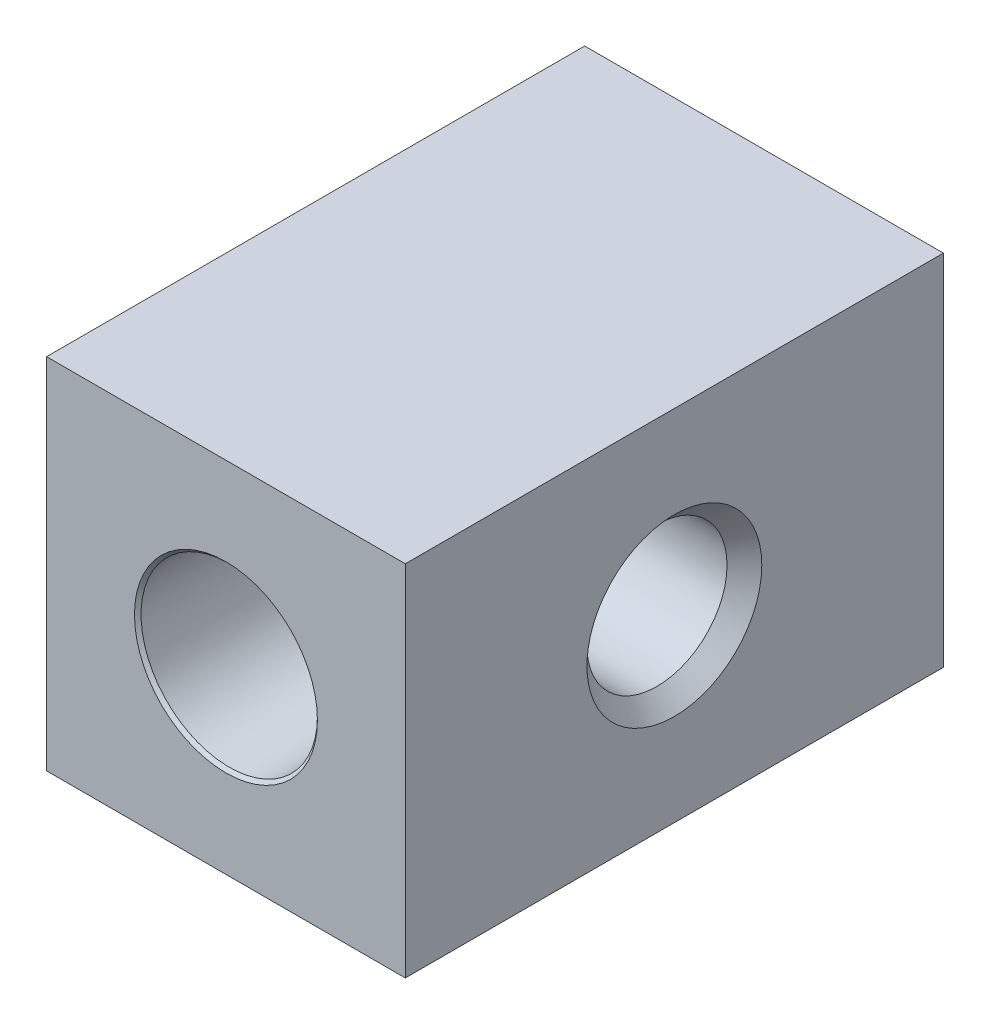
ISO-10303-21;
HEADER;
FILE_DESCRIPTION(('STEP AP214'),'2;1');
FILE_NAME('part.step','',(''),(''),'','','');
FILE_SCHEMA(('AUTOMOTIVE_DESIGN { 1 0 10303 214 1 1 1 1 }'));
ENDSEC;
DATA;
#1=APPLICATION_CONTEXT('core data for automotive mechanical design processes');
#2=APPLICATION_PROTOCOL_DEFINITION('international standard','automotive_design',2000,#1);
#3=PRODUCT_CONTEXT('',#1,'mechanical');
#4=PRODUCT('Part','Part','',(#3));
#5=PRODUCT_RELATED_PRODUCT_CATEGORY('part','',(#4));
#6=PRODUCT_DEFINITION_FORMATION('','',#4);
#7=PRODUCT_DEFINITION_CONTEXT('part definition',#1,'design');
#8=PRODUCT_DEFINITION('design','',#6,#7);
#9=PRODUCT_DEFINITION_SHAPE('','',#8);
#10=(LENGTH_UNIT() NAMED_UNIT(*) SI_UNIT(.MILLI.,.METRE.));
#11=(NAMED_UNIT(*) PLANE_ANGLE_UNIT() SI_UNIT($,.RADIAN.));
#12=(NAMED_UNIT(*) SI_UNIT($,.STERADIAN.) SOLID_ANGLE_UNIT());
#13=UNCERTAINTY_MEASURE_WITH_UNIT(LENGTH_MEASURE(1.E-05),#10,'distance_accuracy_value','');
#14=(GEOMETRIC_REPRESENTATION_CONTEXT(3) GLOBAL_UNCERTAINTY_ASSIGNED_CONTEXT((#13)) GLOBAL_UNIT_ASSIGNED_CONTEXT((#10,
#11,#12)) REPRESENTATION_CONTEXT('',''));
#15=CARTESIAN_POINT('',(0.,0.,0.));
#16=DIRECTION('',(0.,0.,1.));
#17=DIRECTION('',(1.,0.,0.));
#18=AXIS2_PLACEMENT_3D('',#15,#16,#17);
#19=CARTESIAN_POINT('',(12.7,12.7,38.1));
#20=DIRECTION('',(-1.,0.,0.));
#21=DIRECTION('',(0.,-1.,0.));
#22=AXIS2_PLACEMENT_3D('',#19,#20,#21);
#23=PLANE('',#22);
#24=CARTESIAN_POINT('',(12.7,0.,19.05));
#25=DIRECTION('',(1.,0.,0.));
#26=DIRECTION('',(0.,0.,-1.));
#27=AXIS2_PLACEMENT_3D('',#24,#25,#26);
#28=CIRCLE('',#27,6.19125);
#29=CARTESIAN_POINT('',(12.7,0.,12.85875));
#30=VERTEX_POINT('',#29);
#31=EDGE_CURVE('E182',#30,#30,#28,.T.);
#32=ORIENTED_EDGE('',*,*,#31,.F.);
#33=EDGE_LOOP('',(#32));
#34=FACE_BOUND('',#33,.T.);
#35=DIRECTION('',(0.,1.,0.));
#36=VECTOR('',#35,1.);
#37=CARTESIAN_POINT('',(12.7,12.7,0.));
#38=LINE('',#37,#36);
#39=CARTESIAN_POINT('',(12.7,-12.7,0.));
#40=VERTEX_POINT('',#39);
#41=CARTESIAN_POINT('',(12.7,12.7,0.));
#42=VERTEX_POINT('',#41);
#43=EDGE_CURVE('E126',#40,#42,#38,.T.);
#44=ORIENTED_EDGE('',*,*,#43,.T.);
#45=DIRECTION('',(0.,0.,-1.));
#46=VECTOR('',#45,1.);
#47=CARTESIAN_POINT('',(12.7,12.7,38.1));
#48=LINE('',#47,#46);
#49=CARTESIAN_POINT('',(12.7,12.7,38.1));
#50=VERTEX_POINT('',#49);
#51=EDGE_CURVE('E11',#50,#42,#48,.T.);
#52=ORIENTED_EDGE('',*,*,#51,.F.);
#53=DIRECTION('',(0.,1.,0.));
#54=VECTOR('',#53,1.);
#55=CARTESIAN_POINT('',(12.7,12.7,38.1));
#56=LINE('',#55,#54);
#57=CARTESIAN_POINT('',(12.7,-12.7,38.1));
#58=VERTEX_POINT('',#57);
#59=EDGE_CURVE('E109',#58,#50,#56,.T.);
#60=ORIENTED_EDGE('',*,*,#59,.F.);
#61=DIRECTION('',(0.,0.,-1.));
#62=VECTOR('',#61,1.);
#63=CARTESIAN_POINT('',(12.7,-12.7,38.1));
#64=LINE('',#63,#62);
#65=EDGE_CURVE('E122',#58,#40,#64,.T.);
#66=ORIENTED_EDGE('',*,*,#65,.T.);
#67=EDGE_LOOP('',(#44,#52,#60,#66));
#68=FACE_BOUND('',#67,.T.);
#69=ADVANCED_FACE('F51',(#34,#68),#23,.F.);
#70=CARTESIAN_POINT('',(-12.7,12.7,38.1));
#71=DIRECTION('',(0.,-1.,0.));
#72=DIRECTION('',(0.,0.,-1.));
#73=AXIS2_PLACEMENT_3D('',#70,#71,#72);
#74=PLANE('',#73);
#75=DIRECTION('',(-1.,0.,0.));
#76=VECTOR('',#75,1.);
#77=CARTESIAN_POINT('',(-12.7,12.7,0.));
#78=LINE('',#77,#76);
#79=CARTESIAN_POINT('',(-12.7,12.7,0.));
#80=VERTEX_POINT('',#79);
#81=EDGE_CURVE('E114',#42,#80,#78,.T.);
#82=ORIENTED_EDGE('',*,*,#81,.T.);
#83=DIRECTION('',(0.,0.,-1.));
#84=VECTOR('',#83,1.);
#85=CARTESIAN_POINT('',(-12.7,12.7,38.1));
#86=LINE('',#85,#84);
#87=CARTESIAN_POINT('',(-12.7,12.7,38.1));
#88=VERTEX_POINT('',#87);
#89=EDGE_CURVE('E66',#88,#80,#86,.T.);
#90=ORIENTED_EDGE('',*,*,#89,.F.);
#91=DIRECTION('',(-1.,0.,0.));
#92=VECTOR('',#91,1.);
#93=CARTESIAN_POINT('',(-12.7,12.7,38.1));
#94=LINE('',#93,#92);
#95=EDGE_CURVE('E104',#50,#88,#94,.T.);
#96=ORIENTED_EDGE('',*,*,#95,.F.);
#97=ORIENTED_EDGE('',*,*,#51,.T.);
#98=EDGE_LOOP('',(#82,#90,#96,#97));
#99=FACE_BOUND('',#98,.T.);
#100=ADVANCED_FACE('F113',(#99),#74,.F.);
#101=CARTESIAN_POINT('',(-12.7,12.7,38.1));
#102=DIRECTION('',(1.,0.,0.));
#103=DIRECTION('',(0.,1.,0.));
#104=AXIS2_PLACEMENT_3D('',#101,#102,#103);
#105=PLANE('',#104);
#106=DIRECTION('',(0.,-1.,0.));
#107=VECTOR('',#106,1.);
#108=CARTESIAN_POINT('',(-12.7,12.7,0.));
#109=LINE('',#108,#107);
#110=CARTESIAN_POINT('',(-12.7,-12.7,0.));
#111=VERTEX_POINT('',#110);
#112=EDGE_CURVE('E91',#80,#111,#109,.T.);
#113=ORIENTED_EDGE('',*,*,#112,.T.);
#114=DIRECTION('',(0.,0.,-1.));
#115=VECTOR('',#114,1.);
#116=CARTESIAN_POINT('',(-12.7,-12.7,38.1));
#117=LINE('',#116,#115);
#118=CARTESIAN_POINT('',(-12.7,-12.7,38.1));
#119=VERTEX_POINT('',#118);
#120=EDGE_CURVE('E116',#119,#111,#117,.T.);
#121=ORIENTED_EDGE('',*,*,#120,.F.);
#122=DIRECTION('',(0.,-1.,0.));
#123=VECTOR('',#122,1.);
#124=CARTESIAN_POINT('',(-12.7,12.7,38.1));
#125=LINE('',#124,#123);
#126=EDGE_CURVE('E107',#88,#119,#125,.T.);
#127=ORIENTED_EDGE('',*,*,#126,.F.);
#128=ORIENTED_EDGE('',*,*,#89,.T.);
#129=EDGE_LOOP('',(#113,#121,#127,#128));
#130=FACE_BOUND('',#129,.T.);
#131=ADVANCED_FACE('F118',(#130),#105,.F.);
#132=CARTESIAN_POINT('',(-12.7,-12.7,38.1));
#133=DIRECTION('',(0.,1.,0.));
#134=DIRECTION('',(0.,0.,1.));
#135=AXIS2_PLACEMENT_3D('',#132,#133,#134);
#136=PLANE('',#135);
#137=DIRECTION('',(1.,0.,0.));
#138=VECTOR('',#137,1.);
#139=CARTESIAN_POINT('',(-12.7,-12.7,0.));
#140=LINE('',#139,#138);
#141=EDGE_CURVE('E97',#111,#40,#140,.T.);
#142=ORIENTED_EDGE('',*,*,#141,.T.);
#143=ORIENTED_EDGE('',*,*,#65,.F.);
#144=DIRECTION('',(1.,0.,0.));
#145=VECTOR('',#144,1.);
#146=CARTESIAN_POINT('',(-12.7,-12.7,38.1));
#147=LINE('',#146,#145);
#148=EDGE_CURVE('E74',#119,#58,#147,.T.);
#149=ORIENTED_EDGE('',*,*,#148,.F.);
#150=ORIENTED_EDGE('',*,*,#120,.T.);
#151=EDGE_LOOP('',(#142,#143,#149,#150));
#152=FACE_BOUND('',#151,.T.);
#153=ADVANCED_FACE('F140',(#152),#136,.F.);
#154=CARTESIAN_POINT('',(0.,0.,38.1));
#155=DIRECTION('',(0.,0.,1.));
#156=DIRECTION('',(1.,0.,0.));
#157=AXIS2_PLACEMENT_3D('',#154,#155,#156);
#158=PLANE('',#157);
#159=CARTESIAN_POINT('',(0.,0.,38.1));
#160=DIRECTION('',(0.,0.,1.));
#161=DIRECTION('',(1.,0.,0.));
#162=AXIS2_PLACEMENT_3D('',#159,#160,#161);
#163=CIRCLE('',#162,6.477);
#164=CARTESIAN_POINT('',(6.477,0.,38.1));
#165=VERTEX_POINT('',#164);
#166=EDGE_CURVE('E158',#165,#165,#163,.T.);
#167=ORIENTED_EDGE('',*,*,#166,.F.);
#168=EDGE_LOOP('',(#167));
#169=FACE_BOUND('',#168,.T.);
#170=ORIENTED_EDGE('',*,*,#59,.T.);
#171=ORIENTED_EDGE('',*,*,#95,.T.);
#172=ORIENTED_EDGE('',*,*,#126,.T.);
#173=ORIENTED_EDGE('',*,*,#148,.T.);
#174=EDGE_LOOP('',(#170,#171,#172,#173));
#175=FACE_BOUND('',#174,.T.);
#176=ADVANCED_FACE('F105',(#169,#175),#158,.T.);
#177=CARTESIAN_POINT('',(0.,0.,0.));
#178=DIRECTION('',(0.,0.,1.));
#179=DIRECTION('',(1.,0.,0.));
#180=AXIS2_PLACEMENT_3D('',#177,#178,#179);
#181=PLANE('',#180);
#182=CARTESIAN_POINT('',(0.,0.,0.));
#183=DIRECTION('',(0.,0.,-1.));
#184=DIRECTION('',(-1.,0.,0.));
#185=AXIS2_PLACEMENT_3D('',#182,#183,#184);
#186=CIRCLE('',#185,6.477);
#187=CARTESIAN_POINT('',(-6.477,0.,0.));
#188=VERTEX_POINT('',#187);
#189=EDGE_CURVE('E174',#188,#188,#186,.T.);
#190=ORIENTED_EDGE('',*,*,#189,.F.);
#191=EDGE_LOOP('',(#190));
#192=FACE_BOUND('',#191,.T.);
#193=ORIENTED_EDGE('',*,*,#43,.F.);
#194=ORIENTED_EDGE('',*,*,#141,.F.);
#195=ORIENTED_EDGE('',*,*,#112,.F.);
#196=ORIENTED_EDGE('',*,*,#81,.F.);
#197=EDGE_LOOP('',(#193,#194,#195,#196));
#198=FACE_BOUND('',#197,.T.);
#199=ADVANCED_FACE('F143',(#192,#198),#181,.F.);
#200=CARTESIAN_POINT('',(0.,0.,38.1));
#201=DIRECTION('',(0.,0.,1.));
#202=DIRECTION('',(1.,0.,0.));
#203=AXIS2_PLACEMENT_3D('',#200,#201,#202);
#204=CYLINDRICAL_SURFACE('',#203,5.5626);
#205=CARTESIAN_POINT('',(5.5626,0.,14.08938));
#206=CARTESIAN_POINT('',(5.56259949190071,0.115252980041368,14.0893805122402));
#207=CARTESIAN_POINT('',(5.55901059956937,0.230514411394984,14.0934039638876));
#208=CARTESIAN_POINT('',(5.54473406575567,0.460086380413685,14.1094210002691));
#209=CARTESIAN_POINT('',(5.53404302223932,0.574396435772569,14.1214184046442));
#210=CARTESIAN_POINT('',(5.50578060750856,0.801237720933191,14.1531740281014));
#211=CARTESIAN_POINT('',(5.48819921358699,0.913766109919133,14.1729435526448));
#212=CARTESIAN_POINT('',(5.44652522096436,1.13608183250098,14.2198876244221));
#213=CARTESIAN_POINT('',(5.42242958119108,1.24586785965366,14.2470656302371));
#214=CARTESIAN_POINT('',(5.36840350945301,1.46115946784248,14.3081448544504));
#215=CARTESIAN_POINT('',(5.33851692791091,1.5666904336828,14.3419955768647));
#216=CARTESIAN_POINT('',(5.2733298261402,1.77378610759023,14.4160442633293));
#217=CARTESIAN_POINT('',(5.23802732161843,1.87534934477465,14.4562445539031));
#218=CARTESIAN_POINT('',(5.12484025955753,2.17338329338206,14.5855875874288));
#219=CARTESIAN_POINT('',(5.03962815680738,2.36338369792312,14.6835263708614));
#220=CARTESIAN_POINT('',(4.88241970055584,2.66918292387232,14.8661377715473));
#221=CARTESIAN_POINT('',(4.81422308516397,2.79004143346305,14.9458613185622));
#222=CARTESIAN_POINT('',(4.67199005212612,3.02217289074067,15.1136680618453));
#223=CARTESIAN_POINT('',(4.59795327871513,3.13344525360293,15.201751767456));
#224=CARTESIAN_POINT('',(4.4452405116387,3.34657953499793,15.385573472074));
#225=CARTESIAN_POINT('',(4.36655389471765,3.44841842340169,15.4813291915274));
#226=CARTESIAN_POINT('',(4.20603143395974,3.64248108408585,15.6796400899204));
#227=CARTESIAN_POINT('',(4.12419600849026,3.73470612771431,15.7821943668675));
#228=CARTESIAN_POINT('',(3.95682716682526,3.91167516338512,15.9961075789501));
#229=CARTESIAN_POINT('',(3.87125197613791,3.99620129934715,16.1076137169746));
#230=CARTESIAN_POINT('',(3.69975323604535,4.15548288960014,16.3372074153377));
#231=CARTESIAN_POINT('',(3.61382959347561,4.23023552505319,16.4552968604639));
#232=CARTESIAN_POINT('',(3.44371513254162,4.36983061166718,16.698000639979));
#233=CARTESIAN_POINT('',(3.35952142226834,4.43469100651044,16.8226025961943));
#234=CARTESIAN_POINT('',(3.19527803581857,4.55445128444737,17.0790258131456));
#235=CARTESIAN_POINT('',(3.11522554958533,4.60935798676526,17.2108420501966));
#236=CARTESIAN_POINT('',(2.96232201891316,4.70909095818097,17.4836457121999));
#237=CARTESIAN_POINT('',(2.88952360961916,4.75384618883875,17.6246893737475));
#238=CARTESIAN_POINT('',(2.75747220625048,4.83163832211537,17.9161134922143));
#239=CARTESIAN_POINT('',(2.69820103236246,4.86469098565409,18.0664810683501));
#240=CARTESIAN_POINT('',(2.60934071220724,4.91284158970409,18.3507950974902));
#241=CARTESIAN_POINT('',(2.57645600812314,4.93001034416246,18.4833185015918));
#242=CARTESIAN_POINT('',(2.53095522009755,4.95353281423675,18.7526339438798));
#243=CARTESIAN_POINT('',(2.51829233700312,4.95991150322591,18.8894153769621));
#244=CARTESIAN_POINT('',(2.51571876186817,4.96121783332367,19.16372345259));
#245=CARTESIAN_POINT('',(2.52588375931951,4.95610738028207,19.3012510614811));
#246=CARTESIAN_POINT('',(2.56700824513023,4.93492522078184,19.572362288627));
#247=CARTESIAN_POINT('',(2.59801268983963,4.91882981563888,19.7059367270363));
#248=CARTESIAN_POINT('',(2.69488946388761,4.8666516108559,20.031026485035));
#249=CARTESIAN_POINT('',(2.77041652956899,4.82462654883108,20.2186334759294));
#250=CARTESIAN_POINT('',(2.89819216338976,4.74821383178061,20.4891187362788));
#251=CARTESIAN_POINT('',(2.943324960665,4.7204302741996,20.5776602665114));
#252=CARTESIAN_POINT('',(3.03712769599841,4.66062835875333,20.7513863532979));
#253=CARTESIAN_POINT('',(3.08579678501031,4.62861101589539,20.8365717081277));
#254=CARTESIAN_POINT('',(3.22408596948067,4.53422729753461,21.0684651235543));
#255=CARTESIAN_POINT('',(3.31629596117094,4.46752349877629,21.2118621801457));
#256=CARTESIAN_POINT('',(3.50403472122369,4.32185443628983,21.4900763928202));
#257=CARTESIAN_POINT('',(3.59956575125456,4.24288068436623,21.6248875175483));
#258=CARTESIAN_POINT('',(3.7909535326138,4.07278523925148,21.8862771809006));
#259=CARTESIAN_POINT('',(3.88681015121405,3.98166802490132,22.0128587293298));
#260=CARTESIAN_POINT('',(4.07655252007048,3.78717551846553,22.2577225354059));
#261=CARTESIAN_POINT('',(4.17043911219892,3.68380559342417,22.3760083909333));
#262=CARTESIAN_POINT('',(4.3377421967348,3.48428961245477,22.5833085504458));
#263=CARTESIAN_POINT('',(4.41180488034349,3.39018456610727,22.6737627644791));
#264=CARTESIAN_POINT('',(4.55619529593195,3.19351104438786,22.8482285623899));
#265=CARTESIAN_POINT('',(4.62652209715971,3.0909404760322,22.9322385430544));
#266=CARTESIAN_POINT('',(4.82997448589683,2.77084238560862,23.17326883126));
#267=CARTESIAN_POINT('',(4.95600786814505,2.5404243202581,23.3198213800049));
#268=CARTESIAN_POINT('',(5.15517450988648,2.10042335116978,23.5492805426492));
#269=CARTESIAN_POINT('',(5.23385576398246,1.89698951008563,23.639096448429));
#270=CARTESIAN_POINT('',(5.33485575134705,1.57931146644192,23.7538540937933));
#271=CARTESIAN_POINT('',(5.36569180933124,1.47129824203251,23.7887860672551));
#272=CARTESIAN_POINT('',(5.42112951611027,1.25167086339119,23.8514677241027));
#273=CARTESIAN_POINT('',(5.44573388274316,1.14005830297009,23.8792205386603));
#274=CARTESIAN_POINT('',(5.48836172672968,0.913141377573817,23.9272399335587));
#275=CARTESIAN_POINT('',(5.5063374751949,0.797816498979234,23.9474522306649));
#276=CARTESIAN_POINT('',(5.53505933185562,0.565133092629889,23.9797229254185));
#277=CARTESIAN_POINT('',(5.54580542352336,0.447774560226609,23.9917813044252));
#278=CARTESIAN_POINT('',(5.55980804162621,0.212092557170456,24.0074903118468));
#279=CARTESIAN_POINT('',(5.5630673438686,0.0937694604742748,24.0111440563705));
#280=CARTESIAN_POINT('',(5.56202464017189,-0.142793809279318,24.009974819591));
#281=CARTESIAN_POINT('',(5.55772327035698,-0.26103398847574,24.0051525514249));
#282=CARTESIAN_POINT('',(5.5425329671392,-0.483646247271601,23.9881086328893));
#283=CARTESIAN_POINT('',(5.53240544858138,-0.588137259141981,23.9767421233162));
#284=CARTESIAN_POINT('',(5.50641781198981,-0.795501449203402,23.9475414167033));
#285=CARTESIAN_POINT('',(5.49055581559502,-0.898374085751421,23.9297051004349));
#286=CARTESIAN_POINT('',(5.43476975506949,-1.20350306506847,23.8668804752369));
#287=CARTESIAN_POINT('',(5.3866325848794,-1.40245176525898,23.8125619948953));
#288=CARTESIAN_POINT('',(5.2693098747484,-1.79458390934606,23.6794579671663));
#289=CARTESIAN_POINT('',(5.19937173360496,-1.98723381716843,23.5997950536119));
#290=CARTESIAN_POINT('',(5.04311010751813,-2.35576523625907,23.4203709973818));
#291=CARTESIAN_POINT('',(4.95678045039049,-2.53164039343825,23.320602283046));
#292=CARTESIAN_POINT('',(4.79441221635614,-2.82433675665093,23.1308574174977));
#293=CARTESIAN_POINT('',(4.72105309062738,-2.94505328445371,23.0444936981281));
#294=CARTESIAN_POINT('',(4.56875861100239,-3.17617809382747,22.8632927711931));
#295=CARTESIAN_POINT('',(4.48982273561578,-3.28658540912105,22.7684547709646));
#296=CARTESIAN_POINT('',(4.32760104663891,-3.49744828025104,22.570874639734));
#297=CARTESIAN_POINT('',(4.24430185432278,-3.59787011748778,22.4681076792028));
#298=CARTESIAN_POINT('',(4.0750740612814,-3.78847264593812,22.2555577500928));
#299=CARTESIAN_POINT('',(3.98914595510246,-3.87865524848147,22.1457760969263));
#300=CARTESIAN_POINT('',(3.8142071633545,-4.05089471641986,21.916878628063));
#301=CARTESIAN_POINT('',(3.72517099237549,-4.13271757911301,21.797606409433));
#302=CARTESIAN_POINT('',(3.54782489572548,-4.28592874023808,21.5519075964777));
#303=CARTESIAN_POINT('',(3.45951534251486,-4.3573119678742,21.425477566505));
#304=CARTESIAN_POINT('',(3.28640230542381,-4.48930717758529,21.1654391484579));
#305=CARTESIAN_POINT('',(3.20158918745861,-4.54995052069455,21.0318531954096));
#306=CARTESIAN_POINT('',(3.03876891213022,-4.66026152334538,20.7563709399695));
#307=CARTESIAN_POINT('',(2.96075395871779,-4.70994185809475,20.6144844772401));
#308=CARTESIAN_POINT('',(2.82366768728529,-4.7932474252926,20.3351837125752));
#309=CARTESIAN_POINT('',(2.76349733357817,-4.82795516245544,20.1986444616536));
#310=CARTESIAN_POINT('',(2.65897961294455,-4.88630336027154,19.9173379407858));
#311=CARTESIAN_POINT('',(2.61459801299699,-4.90996780008453,19.7725892709089));
#312=CARTESIAN_POINT('',(2.56488651240885,-4.93601377065626,19.5492835822142));
#313=CARTESIAN_POINT('',(2.55108278943874,-4.94313973046992,19.473139375887));
#314=CARTESIAN_POINT('',(2.53016839164672,-4.95387807813479,19.3197110028905));
#315=CARTESIAN_POINT('',(2.52305371091192,-4.95749256896692,19.2424275466969));
#316=CARTESIAN_POINT('',(2.51598738043387,-4.96108292942572,19.0874924940782));
#317=CARTESIAN_POINT('',(2.51603111041091,-4.96106114602624,19.009841167457));
#318=CARTESIAN_POINT('',(2.52325288200823,-4.9573909467926,18.8549754570299));
#319=CARTESIAN_POINT('',(2.53043091988356,-4.95374253286215,18.7777610729946));
#320=CARTESIAN_POINT('',(2.55866519167618,-4.93924785140876,18.5722729095104));
#321=CARTESIAN_POINT('',(2.58584391794516,-4.9251916557246,18.4450411202368));
#322=CARTESIAN_POINT('',(2.65509458676151,-4.88819912028295,18.1960672078814));
#323=CARTESIAN_POINT('',(2.69719100322434,-4.86524818200952,18.0743344787998));
#324=CARTESIAN_POINT('',(2.79074278898134,-4.81218222760155,17.8397213196375));
#325=CARTESIAN_POINT('',(2.84195518364768,-4.78224809035554,17.7267001450552));
#326=CARTESIAN_POINT('',(2.95118175095826,-4.71562743769569,17.5060078182964));
#327=CARTESIAN_POINT('',(3.0092019793767,-4.67893489369156,17.39834155254));
#328=CARTESIAN_POINT('',(3.12985616898902,-4.59910585799672,17.1875492991384));
#329=CARTESIAN_POINT('',(3.19250660724422,-4.55594573007932,17.0844418406807));
#330=CARTESIAN_POINT('',(3.32047732660933,-4.46353958322444,16.8827760668114));
#331=CARTESIAN_POINT('',(3.38579703432321,-4.41429486678915,16.7842167839742));
#332=CARTESIAN_POINT('',(3.54880030997988,-4.28530172751914,16.5460154658557));
#333=CARTESIAN_POINT('',(3.64729100477528,-4.20208101093785,16.4087914555243));
#334=CARTESIAN_POINT('',(3.84421216604824,-4.02272630337395,16.1429162133049));
#335=CARTESIAN_POINT('',(3.94264258312783,-3.92658631762985,16.0142690029091));
#336=CARTESIAN_POINT('',(4.13679595569573,-3.72146886393492,15.7660589115195));
#337=CARTESIAN_POINT('',(4.23252456804228,-3.61252113892556,15.6464760038442));
#338=CARTESIAN_POINT('',(4.41932938337021,-3.38144041711495,15.4167985579353));
#339=CARTESIAN_POINT('',(4.51040563074438,-3.25930754616078,15.3067039291579));
#340=CARTESIAN_POINT('',(4.72353697639025,-2.94624160638993,15.0520269711322));
#341=CARTESIAN_POINT('',(4.84208919237851,-2.74829442112411,14.9129508185251));
#342=CARTESIAN_POINT('',(5.05855379781159,-2.32588961162279,14.6615779446606));
#343=CARTESIAN_POINT('',(5.15648882755717,-2.10146149409114,14.5492518304644));
#344=CARTESIAN_POINT('',(5.31076090269409,-1.66795617276796,14.3733681138699));
#345=CARTESIAN_POINT('',(5.37129375533643,-1.46244615793199,14.3048237761806));
#346=CARTESIAN_POINT('',(5.44451672094022,-1.1452382147626,14.2221483887476));
#347=CARTESIAN_POINT('',(5.46598757932786,-1.03807686946506,14.197955032626));
#348=CARTESIAN_POINT('',(5.50271884820741,-0.821373148210311,14.156612766112));
#349=CARTESIAN_POINT('',(5.51798193260451,-0.711831818859315,14.1394608227071));
#350=CARTESIAN_POINT('',(5.54079260733708,-0.502129025497669,14.1138431353128));
#351=CARTESIAN_POINT('',(5.54895662489938,-0.402118337257024,14.1046830989358));
#352=CARTESIAN_POINT('',(5.55986112453924,-0.201407345689914,14.092450654981));
#353=CARTESIAN_POINT('',(5.56260044397206,-0.100706899171142,14.0893795524097));
#354=CARTESIAN_POINT('',(5.5626,0.,14.08938));
#355=B_SPLINE_CURVE_WITH_KNOTS('',3,(#205,#206,#207,#208,#209,#210,#211,#212,#213,#214,#215,
#216,#217,#218,#219,#220,#221,#222,#223,#224,#225,#226,#227,#228,#229,#230,#231,#232,#233,#234,
#235,#236,#237,#238,#239,#240,#241,#242,#243,#244,#245,#246,#247,#248,#249,#250,#251,#252,#253,
#254,#255,#256,#257,#258,#259,#260,#261,#262,#263,#264,#265,#266,#267,#268,#269,#270,#271,#272,
#273,#274,#275,#276,#277,#278,#279,#280,#281,#282,#283,#284,#285,#286,#287,#288,#289,#290,#291,
#292,#293,#294,#295,#296,#297,#298,#299,#300,#301,#302,#303,#304,#305,#306,#307,#308,#309,#310,
#311,#312,#313,#314,#315,#316,#317,#318,#319,#320,#321,#322,#323,#324,#325,#326,#327,#328,#329,
#330,#331,#332,#333,#334,#335,#336,#337,#338,#339,#340,#341,#342,#343,#344,#345,#346,#347,#348,
#349,#350,#351,#352,#353,#354),.UNSPECIFIED.,.T.,.F.,(4,2,2,2,2,2,2,2,2,2,2,2,2,2,2,2,2,2,2,2,2,
2,2,2,2,2,2,2,2,2,2,2,2,2,2,2,2,2,2,2,2,2,2,2,2,2,2,2,2,2,2,2,2,2,2,2,2,2,2,2,2,2,2,2,2,2,2,2,2,
2,2,2,2,2,4),(0.,0.345648881905928,0.691463454170411,1.03778292670527,1.38426435299766,
1.7282180115991,2.07229799069411,2.75986734391476,3.23944585082315,3.71905359481797,
4.19980294904244,4.68048864744546,5.17210706108524,5.66386695421921,6.15472394723617,
6.64524337517448,7.13909618811423,7.63228133127152,8.04351791345939,8.45380138856857,
8.86544723194859,9.27798396964242,9.89394632815633,10.2034270117262,10.5128336344848,
11.0612674734618,11.6100824152269,12.1586954963424,12.7070691508671,13.1568797609359,
13.6068019155487,14.504114819901,15.208763156076,15.5612888885135,15.913660607529,
16.2685221784585,16.6233845606364,16.9781153525383,17.332816300263,17.6492196064137,
17.9657266463205,18.5982003640966,19.2555210548088,19.9130897506092,20.4091679535346,
20.9052926070486,21.4030393916533,21.9006931099464,22.4097686964854,22.9190907385161,
23.4269000891952,23.9341192085485,24.3927176903526,24.8503156946934,25.0831321500982,
25.3158090881248,25.5483358492007,25.7808624882179,26.171758754975,26.5632993167397,
26.9456458766865,27.3283351613349,27.7124587498774,28.0965002527027,28.6607068334354,
29.2251761255337,29.7883595455586,30.3515375906922,31.1566892543265,31.9609520927299,
32.6326481709019,32.9681050142051,33.3034172111056,33.6053770305186,33.9074015602637),.UNSPECIFIED.);
#356=CARTESIAN_POINT('',(5.5626,0.,14.08938));
#357=VERTEX_POINT('',#356);
#358=EDGE_CURVE('E54',#357,#357,#355,.T.);
#359=ORIENTED_EDGE('',*,*,#358,.T.);
#360=EDGE_LOOP('',(#359));
#361=FACE_BOUND('',#360,.T.);
#362=CARTESIAN_POINT('',(0.,0.,10.02));
#363=DIRECTION('',(0.,0.,-1.));
#364=DIRECTION('',(-1.,0.,0.));
#365=AXIS2_PLACEMENT_3D('',#362,#363,#364);
#366=CIRCLE('',#365,5.56260000000001);
#367=CARTESIAN_POINT('',(-5.56260000000001,0.,10.02));
#368=VERTEX_POINT('',#367);
#369=EDGE_CURVE('E162',#368,#368,#366,.T.);
#370=ORIENTED_EDGE('',*,*,#369,.T.);
#371=EDGE_LOOP('',(#370));
#372=FACE_BOUND('',#371,.T.);
#373=CARTESIAN_POINT('',(0.,0.,28.08));
#374=DIRECTION('',(0.,0.,1.));
#375=DIRECTION('',(1.,0.,0.));
#376=AXIS2_PLACEMENT_3D('',#373,#374,#375);
#377=CIRCLE('',#376,5.5626);
#378=CARTESIAN_POINT('',(5.5626,0.,28.08));
#379=VERTEX_POINT('',#378);
#380=EDGE_CURVE('E130',#379,#379,#377,.T.);
#381=ORIENTED_EDGE('',*,*,#380,.T.);
#382=EDGE_LOOP('',(#381));
#383=FACE_BOUND('',#382,.T.);
#384=ADVANCED_FACE('F204',(#361,#372,#383),#204,.F.);
#385=CARTESIAN_POINT('',(5.5626,0.,28.08));
#386=DIRECTION('',(0.,0.,-1.));
#387=DIRECTION('',(-1.,0.,0.));
#388=AXIS2_PLACEMENT_3D('',#385,#386,#387);
#389=PLANE('',#388);
#390=ORIENTED_EDGE('',*,*,#380,.F.);
#391=EDGE_LOOP('',(#390));
#392=FACE_BOUND('',#391,.T.);
#393=CARTESIAN_POINT('',(0.,0.,28.08));
#394=DIRECTION('',(0.,0.,1.));
#395=DIRECTION('',(1.,0.,0.));
#396=AXIS2_PLACEMENT_3D('',#393,#394,#395);
#397=CIRCLE('',#396,5.95066174625343);
#398=CARTESIAN_POINT('',(5.95066174625343,0.,28.08));
#399=VERTEX_POINT('',#398);
#400=EDGE_CURVE('E150',#399,#399,#397,.T.);
#401=ORIENTED_EDGE('',*,*,#400,.T.);
#402=EDGE_LOOP('',(#401));
#403=FACE_BOUND('',#402,.T.);
#404=ADVANCED_FACE('F210',(#392,#403),#389,.F.);
#405=CARTESIAN_POINT('',(0.,0.,37.8666883));
#406=DIRECTION('',(0.,0.,1.));
#407=DIRECTION('',(1.,0.,0.));
#408=AXIS2_PLACEMENT_3D('',#405,#406,#407);
#409=CONICAL_SURFACE('',#408,6.2436883,0.029932396671703);
#410=ORIENTED_EDGE('',*,*,#400,.F.);
#411=EDGE_LOOP('',(#410));
#412=FACE_BOUND('',#411,.T.);
#413=CARTESIAN_POINT('',(0.,0.,37.8666883));
#414=DIRECTION('',(0.,0.,1.));
#415=DIRECTION('',(1.,0.,0.));
#416=AXIS2_PLACEMENT_3D('',#413,#414,#415);
#417=CIRCLE('',#416,6.2436883);
#418=CARTESIAN_POINT('',(6.2436883,0.,37.8666883));
#419=VERTEX_POINT('',#418);
#420=EDGE_CURVE('E154',#419,#419,#417,.T.);
#421=ORIENTED_EDGE('',*,*,#420,.T.);
#422=EDGE_LOOP('',(#421));
#423=FACE_BOUND('',#422,.T.);
#424=ADVANCED_FACE('F214',(#412,#423),#409,.F.);
#425=CARTESIAN_POINT('',(0.,0.,38.1));
#426=DIRECTION('',(0.,0.,1.));
#427=DIRECTION('',(1.,0.,0.));
#428=AXIS2_PLACEMENT_3D('',#425,#426,#427);
#429=CONICAL_SURFACE('',#428,6.477,0.785398163397458);
#430=ORIENTED_EDGE('',*,*,#420,.F.);
#431=EDGE_LOOP('',(#430));
#432=FACE_BOUND('',#431,.T.);
#433=ORIENTED_EDGE('',*,*,#166,.T.);
#434=EDGE_LOOP('',(#433));
#435=FACE_BOUND('',#434,.T.);
#436=ADVANCED_FACE('F218',(#432,#435),#429,.F.);
#437=CARTESIAN_POINT('',(5.56260000000001,0.,10.02));
#438=DIRECTION('',(0.,0.,1.));
#439=DIRECTION('',(1.,0.,0.));
#440=AXIS2_PLACEMENT_3D('',#437,#438,#439);
#441=PLANE('',#440);
#442=ORIENTED_EDGE('',*,*,#369,.F.);
#443=EDGE_LOOP('',(#442));
#444=FACE_BOUND('',#443,.T.);
#445=CARTESIAN_POINT('',(0.,0.,10.02));
#446=DIRECTION('',(0.,0.,-1.));
#447=DIRECTION('',(-1.,0.,0.));
#448=AXIS2_PLACEMENT_3D('',#445,#446,#447);
#449=CIRCLE('',#448,5.95066174625343);
#450=CARTESIAN_POINT('',(-5.95066174625343,0.,10.02));
#451=VERTEX_POINT('',#450);
#452=EDGE_CURVE('E166',#451,#451,#449,.T.);
#453=ORIENTED_EDGE('',*,*,#452,.T.);
#454=EDGE_LOOP('',(#453));
#455=FACE_BOUND('',#454,.T.);
#456=ADVANCED_FACE('F222',(#444,#455),#441,.F.);
#457=CARTESIAN_POINT('',(0.,0.,0.233311699999997));
#458=DIRECTION('',(0.,0.,-1.));
#459=DIRECTION('',(-1.,0.,0.));
#460=AXIS2_PLACEMENT_3D('',#457,#458,#459);
#461=CONICAL_SURFACE('',#460,6.2436883,0.029932396671703);
#462=ORIENTED_EDGE('',*,*,#452,.F.);
#463=EDGE_LOOP('',(#462));
#464=FACE_BOUND('',#463,.T.);
#465=CARTESIAN_POINT('',(0.,0.,0.233311699999997));
#466=DIRECTION('',(0.,0.,-1.));
#467=DIRECTION('',(-1.,0.,0.));
#468=AXIS2_PLACEMENT_3D('',#465,#466,#467);
#469=CIRCLE('',#468,6.2436883);
#470=CARTESIAN_POINT('',(-6.2436883,0.,0.233311699999997));
#471=VERTEX_POINT('',#470);
#472=EDGE_CURVE('E170',#471,#471,#469,.T.);
#473=ORIENTED_EDGE('',*,*,#472,.T.);
#474=EDGE_LOOP('',(#473));
#475=FACE_BOUND('',#474,.T.);
#476=ADVANCED_FACE('F226',(#464,#475),#461,.F.);
#477=CARTESIAN_POINT('',(0.,0.,0.));
#478=DIRECTION('',(0.,0.,-1.));
#479=DIRECTION('',(-1.,0.,0.));
#480=AXIS2_PLACEMENT_3D('',#477,#478,#479);
#481=CONICAL_SURFACE('',#480,6.477,0.785398163397454);
#482=ORIENTED_EDGE('',*,*,#472,.F.);
#483=EDGE_LOOP('',(#482));
#484=FACE_BOUND('',#483,.T.);
#485=ORIENTED_EDGE('',*,*,#189,.T.);
#486=EDGE_LOOP('',(#485));
#487=FACE_BOUND('',#486,.T.);
#488=ADVANCED_FACE('F230',(#484,#487),#481,.F.);
#489=CARTESIAN_POINT('',(12.7,0.,19.05));
#490=DIRECTION('',(1.,0.,0.));
#491=DIRECTION('',(0.,0.,-1.));
#492=AXIS2_PLACEMENT_3D('',#489,#490,#491);
#493=CYLINDRICAL_SURFACE('',#492,4.96061999999999);
#494=CARTESIAN_POINT('',(11.46937,0.,19.05));
#495=DIRECTION('',(1.,0.,0.));
#496=DIRECTION('',(0.,0.,-1.));
#497=AXIS2_PLACEMENT_3D('',#494,#495,#496);
#498=CIRCLE('',#497,4.96061999999999);
#499=CARTESIAN_POINT('',(11.46937,0.,14.08938));
#500=VERTEX_POINT('',#499);
#501=EDGE_CURVE('E178',#500,#500,#498,.T.);
#502=ORIENTED_EDGE('',*,*,#501,.T.);
#503=EDGE_LOOP('',(#502));
#504=FACE_BOUND('',#503,.T.);
#505=ORIENTED_EDGE('',*,*,#358,.F.);
#506=EDGE_LOOP('',(#505));
#507=FACE_BOUND('',#506,.T.);
#508=ADVANCED_FACE('F233',(#504,#507),#493,.F.);
#509=CARTESIAN_POINT('',(12.7,0.,19.05));
#510=DIRECTION('',(1.,0.,0.));
#511=DIRECTION('',(0.,0.,-1.));
#512=AXIS2_PLACEMENT_3D('',#509,#510,#511);
#513=CONICAL_SURFACE('',#512,6.19125,0.785398163397448);
#514=ORIENTED_EDGE('',*,*,#501,.F.);
#515=EDGE_LOOP('',(#514));
#516=FACE_BOUND('',#515,.T.);
#517=ORIENTED_EDGE('',*,*,#31,.T.);
#518=EDGE_LOOP('',(#517));
#519=FACE_BOUND('',#518,.T.);
#520=ADVANCED_FACE('F187',(#516,#519),#513,.F.);
#521=CLOSED_SHELL('',(#69,#100,#131,#153,#176,#199,#384,#404,#424,#436,#456,#476,#488,#508,#520));
#522=MANIFOLD_SOLID_BREP('B2',#521);
#523=ADVANCED_BREP_SHAPE_REPRESENTATION('',(#18,#522),#14);
#524=SHAPE_DEFINITION_REPRESENTATION(#9,#523);
ENDSEC;
END-ISO-10303-21;
